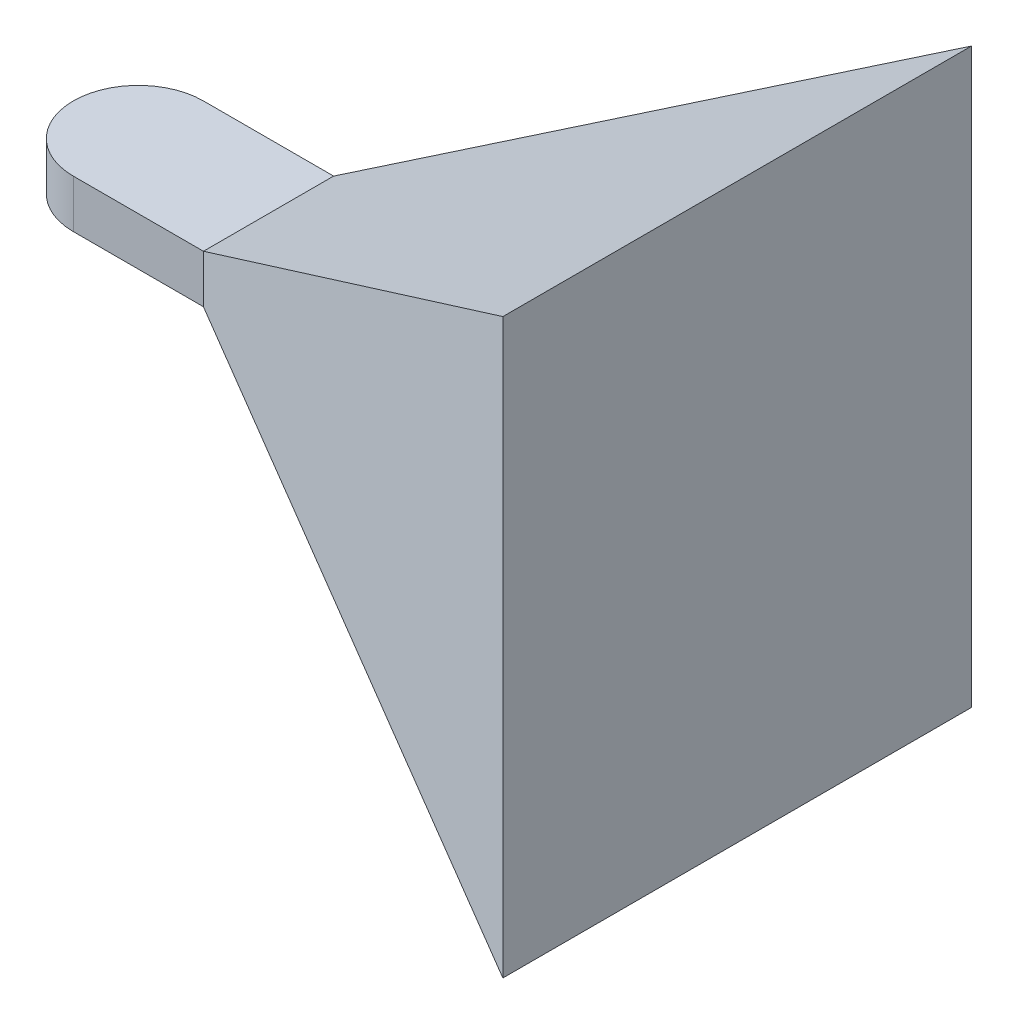
ISO-10303-21;
HEADER;
FILE_DESCRIPTION(('STEP AP214'),'2;1');
FILE_NAME('part.step','',(''),(''),'','','');
FILE_SCHEMA(('AUTOMOTIVE_DESIGN { 1 0 10303 214 1 1 1 1 }'));
ENDSEC;
DATA;
#1=APPLICATION_CONTEXT('core data for automotive mechanical design processes');
#2=APPLICATION_PROTOCOL_DEFINITION('international standard','automotive_design',2000,#1);
#3=PRODUCT_CONTEXT('',#1,'mechanical');
#4=PRODUCT('Part','Part','',(#3));
#5=PRODUCT_RELATED_PRODUCT_CATEGORY('part','',(#4));
#6=PRODUCT_DEFINITION_FORMATION('','',#4);
#7=PRODUCT_DEFINITION_CONTEXT('part definition',#1,'design');
#8=PRODUCT_DEFINITION('design','',#6,#7);
#9=PRODUCT_DEFINITION_SHAPE('','',#8);
#10=(LENGTH_UNIT() NAMED_UNIT(*) SI_UNIT(.MILLI.,.METRE.));
#11=(NAMED_UNIT(*) PLANE_ANGLE_UNIT() SI_UNIT($,.RADIAN.));
#12=(NAMED_UNIT(*) SI_UNIT($,.STERADIAN.) SOLID_ANGLE_UNIT());
#13=UNCERTAINTY_MEASURE_WITH_UNIT(LENGTH_MEASURE(1.E-05),#10,'distance_accuracy_value','');
#14=(GEOMETRIC_REPRESENTATION_CONTEXT(3) GLOBAL_UNCERTAINTY_ASSIGNED_CONTEXT((#13)) GLOBAL_UNIT_ASSIGNED_CONTEXT((#10,
#11,#12)) REPRESENTATION_CONTEXT('',''));
#15=CARTESIAN_POINT('',(0.,0.,0.));
#16=DIRECTION('',(0.,0.,1.));
#17=DIRECTION('',(1.,0.,0.));
#18=AXIS2_PLACEMENT_3D('',#15,#16,#17);
#19=CARTESIAN_POINT('',(0.,-139.7,0.));
#20=DIRECTION('',(0.,1.,0.));
#21=DIRECTION('',(0.,0.,1.));
#22=AXIS2_PLACEMENT_3D('',#19,#20,#21);
#23=CYLINDRICAL_SURFACE('',#22,31.75);
#24=CARTESIAN_POINT('',(0.,-11.7239490143577,0.));
#25=DIRECTION('',(0.,-1.,0.));
#26=DIRECTION('',(0.,0.,-1.));
#27=AXIS2_PLACEMENT_3D('',#24,#25,#26);
#28=CIRCLE('',#27,31.75);
#29=CARTESIAN_POINT('',(0.,-11.7239490143577,-31.75));
#30=VERTEX_POINT('',#29);
#31=CARTESIAN_POINT('',(0.,-11.7239490143577,31.75));
#32=VERTEX_POINT('',#31);
#33=EDGE_CURVE('E139',#30,#32,#28,.F.);
#34=ORIENTED_EDGE('',*,*,#33,.T.);
#35=DIRECTION('',(0.,1.,0.));
#36=VECTOR('',#35,1.);
#37=CARTESIAN_POINT('',(0.,-139.7,31.75));
#38=LINE('',#37,#36);
#39=CARTESIAN_POINT('',(0.,11.7239490143577,31.75));
#40=VERTEX_POINT('',#39);
#41=EDGE_CURVE('E93',#32,#40,#38,.T.);
#42=ORIENTED_EDGE('',*,*,#41,.T.);
#43=CARTESIAN_POINT('',(0.,11.7239490143577,0.));
#44=DIRECTION('',(0.,1.,0.));
#45=DIRECTION('',(0.,0.,1.));
#46=AXIS2_PLACEMENT_3D('',#43,#44,#45);
#47=CIRCLE('',#46,31.75);
#48=CARTESIAN_POINT('',(0.,11.7239490143577,-31.75));
#49=VERTEX_POINT('',#48);
#50=EDGE_CURVE('E127',#40,#49,#47,.F.);
#51=ORIENTED_EDGE('',*,*,#50,.T.);
#52=DIRECTION('',(0.,1.,0.));
#53=VECTOR('',#52,1.);
#54=CARTESIAN_POINT('',(0.,-139.7,-31.75));
#55=LINE('',#54,#53);
#56=EDGE_CURVE('E113',#30,#49,#55,.T.);
#57=ORIENTED_EDGE('',*,*,#56,.F.);
#58=EDGE_LOOP('',(#34,#42,#51,#57));
#59=FACE_BOUND('',#58,.T.);
#60=ADVANCED_FACE('F33',(#59),#23,.T.);
#61=CARTESIAN_POINT('',(0.,-139.7,-31.75));
#62=DIRECTION('',(0.,0.,-1.));
#63=DIRECTION('',(-1.,0.,0.));
#64=AXIS2_PLACEMENT_3D('',#61,#62,#63);
#65=PLANE('',#64);
#66=DIRECTION('',(0.,1.,0.));
#67=VECTOR('',#66,1.);
#68=CARTESIAN_POINT('',(63.5,-139.7,-31.75));
#69=LINE('',#68,#67);
#70=CARTESIAN_POINT('',(63.5,-11.7239490143577,-31.75));
#71=VERTEX_POINT('',#70);
#72=CARTESIAN_POINT('',(63.5,11.7239490143577,-31.75));
#73=VERTEX_POINT('',#72);
#74=EDGE_CURVE('E107',#71,#73,#69,.T.);
#75=ORIENTED_EDGE('',*,*,#74,.F.);
#76=DIRECTION('',(-1.,0.,0.));
#77=VECTOR('',#76,1.);
#78=CARTESIAN_POINT('',(0.,-11.7239490143577,-31.75));
#79=LINE('',#78,#77);
#80=EDGE_CURVE('E137',#71,#30,#79,.T.);
#81=ORIENTED_EDGE('',*,*,#80,.T.);
#82=ORIENTED_EDGE('',*,*,#56,.T.);
#83=DIRECTION('',(1.,0.,0.));
#84=VECTOR('',#83,1.);
#85=CARTESIAN_POINT('',(0.,11.7239490143577,-31.75));
#86=LINE('',#85,#84);
#87=EDGE_CURVE('E125',#49,#73,#86,.T.);
#88=ORIENTED_EDGE('',*,*,#87,.T.);
#89=EDGE_LOOP('',(#75,#81,#82,#88));
#90=FACE_BOUND('',#89,.T.);
#91=ADVANCED_FACE('F148',(#90),#65,.T.);
#92=CARTESIAN_POINT('',(63.5,-139.7,-31.75));
#93=DIRECTION('',(-0.339644463777557,0.,-0.940553899691696));
#94=DIRECTION('',(-0.940553899691696,0.,0.339644463777557));
#95=AXIS2_PLACEMENT_3D('',#92,#93,#94);
#96=PLANE('',#95);
#97=DIRECTION('',(0.,1.,0.));
#98=VECTOR('',#97,1.);
#99=CARTESIAN_POINT('',(292.1,-139.7,-114.3));
#100=LINE('',#99,#98);
#101=CARTESIAN_POINT('',(292.1,-139.7,-114.3));
#102=VERTEX_POINT('',#101);
#103=CARTESIAN_POINT('',(292.1,139.7,-114.3));
#104=VERTEX_POINT('',#103);
#105=EDGE_CURVE('E105',#102,#104,#100,.T.);
#106=ORIENTED_EDGE('',*,*,#105,.F.);
#107=DIRECTION('',(-0.832234371180709,0.465905810665907,0.300529078481923));
#108=VECTOR('',#107,1.);
#109=CARTESIAN_POINT('',(113.121796100642,-39.5034831691034,-49.6689819252317));
#110=LINE('',#109,#108);
#111=EDGE_CURVE('E47',#102,#71,#110,.T.);
#112=ORIENTED_EDGE('',*,*,#111,.T.);
#113=ORIENTED_EDGE('',*,*,#74,.T.);
#114=DIRECTION('',(0.832234371180709,0.465905810665907,-0.300529078481923));
#115=VECTOR('',#114,1.);
#116=CARTESIAN_POINT('',(4.78644957494881,-21.1453787316809,-10.5478845687315));
#117=LINE('',#116,#115);
#118=EDGE_CURVE('E130',#73,#104,#117,.T.);
#119=ORIENTED_EDGE('',*,*,#118,.T.);
#120=EDGE_LOOP('',(#106,#112,#113,#119));
#121=FACE_BOUND('',#120,.T.);
#122=ADVANCED_FACE('F146',(#121),#96,.T.);
#123=CARTESIAN_POINT('',(292.1,-139.7,114.3));
#124=DIRECTION('',(-0.339644463777557,0.,0.940553899691696));
#125=DIRECTION('',(0.940553899691696,0.,0.339644463777557));
#126=AXIS2_PLACEMENT_3D('',#123,#124,#125);
#127=PLANE('',#126);
#128=DIRECTION('',(0.,1.,0.));
#129=VECTOR('',#128,1.);
#130=CARTESIAN_POINT('',(63.5,-139.7,31.75));
#131=LINE('',#130,#129);
#132=CARTESIAN_POINT('',(63.5,-11.7239490143577,31.75));
#133=VERTEX_POINT('',#132);
#134=CARTESIAN_POINT('',(63.5,11.7239490143577,31.75));
#135=VERTEX_POINT('',#134);
#136=EDGE_CURVE('E101',#133,#135,#131,.T.);
#137=ORIENTED_EDGE('',*,*,#136,.F.);
#138=DIRECTION('',(0.832234371180709,-0.465905810665907,0.300529078481923));
#139=VECTOR('',#138,1.);
#140=CARTESIAN_POINT('',(292.1,-139.7,114.3));
#141=LINE('',#140,#139);
#142=CARTESIAN_POINT('',(292.1,-139.7,114.3));
#143=VERTEX_POINT('',#142);
#144=EDGE_CURVE('E88',#133,#143,#141,.T.);
#145=ORIENTED_EDGE('',*,*,#144,.T.);
#146=DIRECTION('',(0.,1.,0.));
#147=VECTOR('',#146,1.);
#148=CARTESIAN_POINT('',(292.1,-139.7,114.3));
#149=LINE('',#148,#147);
#150=CARTESIAN_POINT('',(292.1,139.7,114.3));
#151=VERTEX_POINT('',#150);
#152=EDGE_CURVE('E99',#143,#151,#149,.T.);
#153=ORIENTED_EDGE('',*,*,#152,.T.);
#154=DIRECTION('',(-0.832234371180709,-0.465905810665907,-0.300529078481923));
#155=VECTOR('',#154,1.);
#156=CARTESIAN_POINT('',(183.764653474307,79.0511380992157,75.1789026434998));
#157=LINE('',#156,#155);
#158=EDGE_CURVE('E55',#151,#135,#157,.T.);
#159=ORIENTED_EDGE('',*,*,#158,.T.);
#160=EDGE_LOOP('',(#137,#145,#153,#159));
#161=FACE_BOUND('',#160,.T.);
#162=ADVANCED_FACE('F98',(#161),#127,.T.);
#163=CARTESIAN_POINT('',(0.,-139.7,31.75));
#164=DIRECTION('',(0.,0.,1.));
#165=DIRECTION('',(1.,0.,0.));
#166=AXIS2_PLACEMENT_3D('',#163,#164,#165);
#167=PLANE('',#166);
#168=ORIENTED_EDGE('',*,*,#41,.F.);
#169=DIRECTION('',(1.,0.,0.));
#170=VECTOR('',#169,1.);
#171=CARTESIAN_POINT('',(0.,-11.7239490143577,31.75));
#172=LINE('',#171,#170);
#173=EDGE_CURVE('E11',#32,#133,#172,.T.);
#174=ORIENTED_EDGE('',*,*,#173,.T.);
#175=ORIENTED_EDGE('',*,*,#136,.T.);
#176=DIRECTION('',(-1.,0.,0.));
#177=VECTOR('',#176,1.);
#178=CARTESIAN_POINT('',(0.,11.7239490143577,31.75));
#179=LINE('',#178,#177);
#180=EDGE_CURVE('E40',#135,#40,#179,.T.);
#181=ORIENTED_EDGE('',*,*,#180,.T.);
#182=EDGE_LOOP('',(#168,#174,#175,#181));
#183=FACE_BOUND('',#182,.T.);
#184=ADVANCED_FACE('F153',(#183),#167,.T.);
#185=CARTESIAN_POINT('',(292.1,-139.7,-114.3));
#186=DIRECTION('',(1.,0.,0.));
#187=DIRECTION('',(0.,0.,-1.));
#188=AXIS2_PLACEMENT_3D('',#185,#186,#187);
#189=PLANE('',#188);
#190=ORIENTED_EDGE('',*,*,#105,.T.);
#191=DIRECTION('',(0.,0.,-1.));
#192=VECTOR('',#191,1.);
#193=CARTESIAN_POINT('',(292.1,139.7,-114.3));
#194=LINE('',#193,#192);
#195=EDGE_CURVE('E94',#151,#104,#194,.T.);
#196=ORIENTED_EDGE('',*,*,#195,.F.);
#197=ORIENTED_EDGE('',*,*,#152,.F.);
#198=DIRECTION('',(0.,0.,-1.));
#199=VECTOR('',#198,1.);
#200=CARTESIAN_POINT('',(292.1,-139.7,-114.3));
#201=LINE('',#200,#199);
#202=EDGE_CURVE('E85',#143,#102,#201,.T.);
#203=ORIENTED_EDGE('',*,*,#202,.T.);
#204=EDGE_LOOP('',(#190,#196,#197,#203));
#205=FACE_BOUND('',#204,.T.);
#206=ADVANCED_FACE('F104',(#205),#189,.T.);
#207=CARTESIAN_POINT('',(-31.75,11.7239490143577,139.7));
#208=DIRECTION('',(0.,1.,0.));
#209=DIRECTION('',(0.,0.,1.));
#210=AXIS2_PLACEMENT_3D('',#207,#208,#209);
#211=PLANE('',#210);
#212=ORIENTED_EDGE('',*,*,#50,.F.);
#213=ORIENTED_EDGE('',*,*,#180,.F.);
#214=DIRECTION('',(0.,0.,-1.));
#215=VECTOR('',#214,1.);
#216=CARTESIAN_POINT('',(63.5,11.7239490143577,139.7));
#217=LINE('',#216,#215);
#218=EDGE_CURVE('E134',#135,#73,#217,.T.);
#219=ORIENTED_EDGE('',*,*,#218,.T.);
#220=ORIENTED_EDGE('',*,*,#87,.F.);
#221=EDGE_LOOP('',(#212,#213,#219,#220));
#222=FACE_BOUND('',#221,.T.);
#223=ADVANCED_FACE('F151',(#222),#211,.T.);
#224=CARTESIAN_POINT('',(63.5,11.7239490143577,139.7));
#225=DIRECTION('',(-0.488487281911682,0.872571014537233,0.));
#226=DIRECTION('',(-0.872571014537233,-0.488487281911682,0.));
#227=AXIS2_PLACEMENT_3D('',#224,#225,#226);
#228=PLANE('',#227);
#229=ORIENTED_EDGE('',*,*,#218,.F.);
#230=ORIENTED_EDGE('',*,*,#158,.F.);
#231=ORIENTED_EDGE('',*,*,#195,.T.);
#232=ORIENTED_EDGE('',*,*,#118,.F.);
#233=EDGE_LOOP('',(#229,#230,#231,#232));
#234=FACE_BOUND('',#233,.T.);
#235=ADVANCED_FACE('F156',(#234),#228,.T.);
#236=CARTESIAN_POINT('',(-31.75,-11.7239490143577,139.7));
#237=DIRECTION('',(0.,-1.,0.));
#238=DIRECTION('',(0.,0.,-1.));
#239=AXIS2_PLACEMENT_3D('',#236,#237,#238);
#240=PLANE('',#239);
#241=DIRECTION('',(0.,0.,-1.));
#242=VECTOR('',#241,1.);
#243=CARTESIAN_POINT('',(63.5,-11.7239490143577,139.7));
#244=LINE('',#243,#242);
#245=EDGE_CURVE('E102',#133,#71,#244,.T.);
#246=ORIENTED_EDGE('',*,*,#245,.F.);
#247=ORIENTED_EDGE('',*,*,#173,.F.);
#248=ORIENTED_EDGE('',*,*,#33,.F.);
#249=ORIENTED_EDGE('',*,*,#80,.F.);
#250=EDGE_LOOP('',(#246,#247,#248,#249));
#251=FACE_BOUND('',#250,.T.);
#252=ADVANCED_FACE('F154',(#251),#240,.T.);
#253=CARTESIAN_POINT('',(63.5,-11.7239490143577,139.7));
#254=DIRECTION('',(-0.488487281911682,-0.872571014537233,0.));
#255=DIRECTION('',(0.872571014537233,-0.488487281911682,0.));
#256=AXIS2_PLACEMENT_3D('',#253,#254,#255);
#257=PLANE('',#256);
#258=ORIENTED_EDGE('',*,*,#202,.F.);
#259=ORIENTED_EDGE('',*,*,#144,.F.);
#260=ORIENTED_EDGE('',*,*,#245,.T.);
#261=ORIENTED_EDGE('',*,*,#111,.F.);
#262=EDGE_LOOP('',(#258,#259,#260,#261));
#263=FACE_BOUND('',#262,.T.);
#264=ADVANCED_FACE('F87',(#263),#257,.T.);
#265=CLOSED_SHELL('',(#60,#91,#122,#162,#184,#206,#223,#235,#252,#264));
#266=MANIFOLD_SOLID_BREP('B2',#265);
#267=ADVANCED_BREP_SHAPE_REPRESENTATION('',(#18,#266),#14);
#268=SHAPE_DEFINITION_REPRESENTATION(#9,#267);
ENDSEC;
END-ISO-10303-21;
